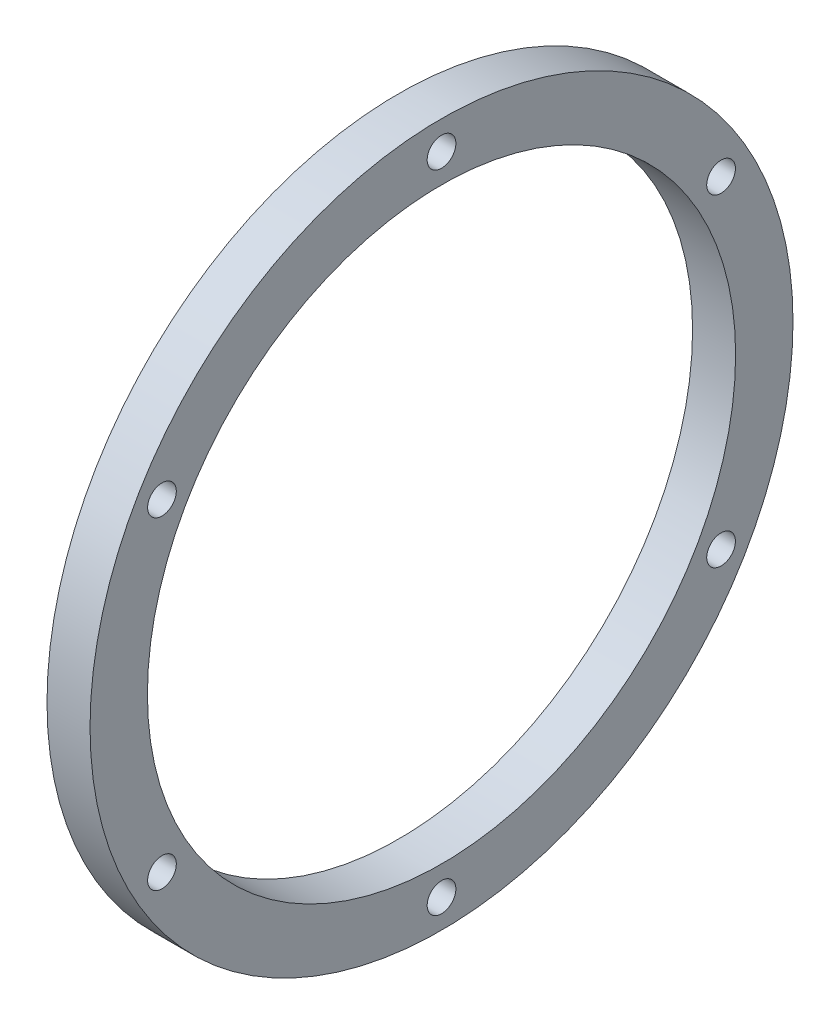
ISO-10303-21;
HEADER;
FILE_DESCRIPTION(('STEP AP214'),'2;1');
FILE_NAME('part.step','',(''),(''),'','','');
FILE_SCHEMA(('AUTOMOTIVE_DESIGN { 1 0 10303 214 1 1 1 1 }'));
ENDSEC;
DATA;
#1=APPLICATION_CONTEXT('core data for automotive mechanical design processes');
#2=APPLICATION_PROTOCOL_DEFINITION('international standard','automotive_design',2000,#1);
#3=PRODUCT_CONTEXT('',#1,'mechanical');
#4=PRODUCT('Part','Part','',(#3));
#5=PRODUCT_RELATED_PRODUCT_CATEGORY('part','',(#4));
#6=PRODUCT_DEFINITION_FORMATION('','',#4);
#7=PRODUCT_DEFINITION_CONTEXT('part definition',#1,'design');
#8=PRODUCT_DEFINITION('design','',#6,#7);
#9=PRODUCT_DEFINITION_SHAPE('','',#8);
#10=(LENGTH_UNIT() NAMED_UNIT(*) SI_UNIT(.MILLI.,.METRE.));
#11=(NAMED_UNIT(*) PLANE_ANGLE_UNIT() SI_UNIT($,.RADIAN.));
#12=(NAMED_UNIT(*) SI_UNIT($,.STERADIAN.) SOLID_ANGLE_UNIT());
#13=UNCERTAINTY_MEASURE_WITH_UNIT(LENGTH_MEASURE(1.E-05),#10,'distance_accuracy_value','');
#14=(GEOMETRIC_REPRESENTATION_CONTEXT(3) GLOBAL_UNCERTAINTY_ASSIGNED_CONTEXT((#13)) GLOBAL_UNIT_ASSIGNED_CONTEXT((#10,
#11,#12)) REPRESENTATION_CONTEXT('',''));
#15=CARTESIAN_POINT('',(0.,0.,0.));
#16=DIRECTION('',(0.,0.,1.));
#17=DIRECTION('',(1.,0.,0.));
#18=AXIS2_PLACEMENT_3D('',#15,#16,#17);
#19=CARTESIAN_POINT('',(6.,0.,0.));
#20=DIRECTION('',(1.,0.,0.));
#21=DIRECTION('',(0.,0.,-1.));
#22=AXIS2_PLACEMENT_3D('',#19,#20,#21);
#23=PLANE('',#22);
#24=CARTESIAN_POINT('',(6.,22.5000000000005,-38.9711431702995));
#25=DIRECTION('',(1.,0.,0.));
#26=DIRECTION('',(0.,0.,-1.));
#27=AXIS2_PLACEMENT_3D('',#24,#25,#26);
#28=CIRCLE('',#27,1.99999999999999);
#29=CARTESIAN_POINT('',(6.,22.5000000000005,-40.9711431702995));
#30=VERTEX_POINT('',#29);
#31=EDGE_CURVE('E88',#30,#30,#28,.T.);
#32=ORIENTED_EDGE('',*,*,#31,.F.);
#33=EDGE_LOOP('',(#32));
#34=FACE_BOUND('',#33,.T.);
#35=CARTESIAN_POINT('',(6.,-22.4999999999996,-38.9711431702999));
#36=DIRECTION('',(1.,0.,0.));
#37=DIRECTION('',(0.,0.,-1.));
#38=AXIS2_PLACEMENT_3D('',#35,#36,#37);
#39=CIRCLE('',#38,1.99999999999999);
#40=CARTESIAN_POINT('',(6.,-22.4999999999996,-40.9711431702999));
#41=VERTEX_POINT('',#40);
#42=EDGE_CURVE('E82',#41,#41,#39,.T.);
#43=ORIENTED_EDGE('',*,*,#42,.F.);
#44=EDGE_LOOP('',(#43));
#45=FACE_BOUND('',#44,.T.);
#46=CARTESIAN_POINT('',(6.,-45.,0.));
#47=DIRECTION('',(1.,0.,0.));
#48=DIRECTION('',(0.,0.,-1.));
#49=AXIS2_PLACEMENT_3D('',#46,#47,#48);
#50=CIRCLE('',#49,1.99999999999999);
#51=CARTESIAN_POINT('',(6.,-45.,-1.99999999999999));
#52=VERTEX_POINT('',#51);
#53=EDGE_CURVE('E76',#52,#52,#50,.T.);
#54=ORIENTED_EDGE('',*,*,#53,.F.);
#55=EDGE_LOOP('',(#54));
#56=FACE_BOUND('',#55,.T.);
#57=CARTESIAN_POINT('',(6.,-22.5000000000002,38.9711431702996));
#58=DIRECTION('',(1.,0.,0.));
#59=DIRECTION('',(0.,0.,-1.));
#60=AXIS2_PLACEMENT_3D('',#57,#58,#59);
#61=CIRCLE('',#60,1.99999999999999);
#62=CARTESIAN_POINT('',(6.,-22.5000000000002,36.9711431702996));
#63=VERTEX_POINT('',#62);
#64=EDGE_CURVE('E70',#63,#63,#61,.T.);
#65=ORIENTED_EDGE('',*,*,#64,.F.);
#66=EDGE_LOOP('',(#65));
#67=FACE_BOUND('',#66,.T.);
#68=CARTESIAN_POINT('',(6.,22.4999999999999,38.9711431702998));
#69=DIRECTION('',(1.,0.,0.));
#70=DIRECTION('',(0.,0.,-1.));
#71=AXIS2_PLACEMENT_3D('',#68,#69,#70);
#72=CIRCLE('',#71,1.99999999999999);
#73=CARTESIAN_POINT('',(6.,22.4999999999999,36.9711431702998));
#74=VERTEX_POINT('',#73);
#75=EDGE_CURVE('E64',#74,#74,#72,.T.);
#76=ORIENTED_EDGE('',*,*,#75,.F.);
#77=EDGE_LOOP('',(#76));
#78=FACE_BOUND('',#77,.T.);
#79=CARTESIAN_POINT('',(6.,45.,0.));
#80=DIRECTION('',(1.,0.,0.));
#81=DIRECTION('',(0.,0.,-1.));
#82=AXIS2_PLACEMENT_3D('',#79,#80,#81);
#83=CIRCLE('',#82,1.99999999999999);
#84=CARTESIAN_POINT('',(6.,45.,-1.99999999999999));
#85=VERTEX_POINT('',#84);
#86=EDGE_CURVE('E58',#85,#85,#83,.T.);
#87=ORIENTED_EDGE('',*,*,#86,.F.);
#88=EDGE_LOOP('',(#87));
#89=FACE_BOUND('',#88,.T.);
#90=CARTESIAN_POINT('',(6.,0.,0.));
#91=DIRECTION('',(1.,0.,0.));
#92=DIRECTION('',(0.,0.,-1.));
#93=AXIS2_PLACEMENT_3D('',#90,#91,#92);
#94=CIRCLE('',#93,49.);
#95=CARTESIAN_POINT('',(6.,0.,-49.));
#96=VERTEX_POINT('',#95);
#97=EDGE_CURVE('E10',#96,#96,#94,.T.);
#98=ORIENTED_EDGE('',*,*,#97,.T.);
#99=EDGE_LOOP('',(#98));
#100=FACE_BOUND('',#99,.T.);
#101=CARTESIAN_POINT('',(6.,0.,0.));
#102=DIRECTION('',(1.,0.,0.));
#103=DIRECTION('',(0.,0.,-1.));
#104=AXIS2_PLACEMENT_3D('',#101,#102,#103);
#105=CIRCLE('',#104,41.);
#106=CARTESIAN_POINT('',(6.,0.,-41.));
#107=VERTEX_POINT('',#106);
#108=EDGE_CURVE('E48',#107,#107,#105,.T.);
#109=ORIENTED_EDGE('',*,*,#108,.F.);
#110=EDGE_LOOP('',(#109));
#111=FACE_BOUND('',#110,.T.);
#112=ADVANCED_FACE('F37',(#34,#45,#56,#67,#78,#89,#100,#111),#23,.T.);
#113=CARTESIAN_POINT('',(0.,0.,0.));
#114=DIRECTION('',(1.,0.,0.));
#115=DIRECTION('',(0.,0.,-1.));
#116=AXIS2_PLACEMENT_3D('',#113,#114,#115);
#117=PLANE('',#116);
#118=CARTESIAN_POINT('',(0.,22.5000000000005,-38.9711431702995));
#119=DIRECTION('',(1.,0.,0.));
#120=DIRECTION('',(0.,0.,-1.));
#121=AXIS2_PLACEMENT_3D('',#118,#119,#120);
#122=CIRCLE('',#121,1.99999999999999);
#123=CARTESIAN_POINT('',(0.,22.5000000000005,-40.9711431702995));
#124=VERTEX_POINT('',#123);
#125=EDGE_CURVE('E85',#124,#124,#122,.T.);
#126=ORIENTED_EDGE('',*,*,#125,.T.);
#127=EDGE_LOOP('',(#126));
#128=FACE_BOUND('',#127,.T.);
#129=CARTESIAN_POINT('',(0.,-22.4999999999996,-38.9711431702999));
#130=DIRECTION('',(1.,0.,0.));
#131=DIRECTION('',(0.,0.,-1.));
#132=AXIS2_PLACEMENT_3D('',#129,#130,#131);
#133=CIRCLE('',#132,1.99999999999999);
#134=CARTESIAN_POINT('',(0.,-22.4999999999996,-40.9711431702999));
#135=VERTEX_POINT('',#134);
#136=EDGE_CURVE('E79',#135,#135,#133,.T.);
#137=ORIENTED_EDGE('',*,*,#136,.T.);
#138=EDGE_LOOP('',(#137));
#139=FACE_BOUND('',#138,.T.);
#140=CARTESIAN_POINT('',(0.,-45.,0.));
#141=DIRECTION('',(1.,0.,0.));
#142=DIRECTION('',(0.,0.,-1.));
#143=AXIS2_PLACEMENT_3D('',#140,#141,#142);
#144=CIRCLE('',#143,1.99999999999999);
#145=CARTESIAN_POINT('',(0.,-45.,-1.99999999999999));
#146=VERTEX_POINT('',#145);
#147=EDGE_CURVE('E73',#146,#146,#144,.T.);
#148=ORIENTED_EDGE('',*,*,#147,.T.);
#149=EDGE_LOOP('',(#148));
#150=FACE_BOUND('',#149,.T.);
#151=CARTESIAN_POINT('',(0.,-22.5000000000002,38.9711431702996));
#152=DIRECTION('',(1.,0.,0.));
#153=DIRECTION('',(0.,0.,-1.));
#154=AXIS2_PLACEMENT_3D('',#151,#152,#153);
#155=CIRCLE('',#154,1.99999999999999);
#156=CARTESIAN_POINT('',(0.,-22.5000000000002,36.9711431702996));
#157=VERTEX_POINT('',#156);
#158=EDGE_CURVE('E67',#157,#157,#155,.T.);
#159=ORIENTED_EDGE('',*,*,#158,.T.);
#160=EDGE_LOOP('',(#159));
#161=FACE_BOUND('',#160,.T.);
#162=CARTESIAN_POINT('',(0.,22.4999999999999,38.9711431702998));
#163=DIRECTION('',(1.,0.,0.));
#164=DIRECTION('',(0.,0.,-1.));
#165=AXIS2_PLACEMENT_3D('',#162,#163,#164);
#166=CIRCLE('',#165,1.99999999999999);
#167=CARTESIAN_POINT('',(0.,22.4999999999999,36.9711431702998));
#168=VERTEX_POINT('',#167);
#169=EDGE_CURVE('E61',#168,#168,#166,.T.);
#170=ORIENTED_EDGE('',*,*,#169,.T.);
#171=EDGE_LOOP('',(#170));
#172=FACE_BOUND('',#171,.T.);
#173=CARTESIAN_POINT('',(0.,45.,0.));
#174=DIRECTION('',(1.,0.,0.));
#175=DIRECTION('',(0.,0.,-1.));
#176=AXIS2_PLACEMENT_3D('',#173,#174,#175);
#177=CIRCLE('',#176,1.99999999999999);
#178=CARTESIAN_POINT('',(0.,45.,-1.99999999999999));
#179=VERTEX_POINT('',#178);
#180=EDGE_CURVE('E53',#179,#179,#177,.T.);
#181=ORIENTED_EDGE('',*,*,#180,.T.);
#182=EDGE_LOOP('',(#181));
#183=FACE_BOUND('',#182,.T.);
#184=CARTESIAN_POINT('',(0.,0.,0.));
#185=DIRECTION('',(1.,0.,0.));
#186=DIRECTION('',(0.,0.,-1.));
#187=AXIS2_PLACEMENT_3D('',#184,#185,#186);
#188=CIRCLE('',#187,49.);
#189=CARTESIAN_POINT('',(0.,0.,-49.));
#190=VERTEX_POINT('',#189);
#191=EDGE_CURVE('E41',#190,#190,#188,.T.);
#192=ORIENTED_EDGE('',*,*,#191,.F.);
#193=EDGE_LOOP('',(#192));
#194=FACE_BOUND('',#193,.T.);
#195=CARTESIAN_POINT('',(0.,0.,0.));
#196=DIRECTION('',(1.,0.,0.));
#197=DIRECTION('',(0.,0.,-1.));
#198=AXIS2_PLACEMENT_3D('',#195,#196,#197);
#199=CIRCLE('',#198,41.);
#200=CARTESIAN_POINT('',(0.,0.,-41.));
#201=VERTEX_POINT('',#200);
#202=EDGE_CURVE('E50',#201,#201,#199,.T.);
#203=ORIENTED_EDGE('',*,*,#202,.T.);
#204=EDGE_LOOP('',(#203));
#205=FACE_BOUND('',#204,.T.);
#206=ADVANCED_FACE('F97',(#128,#139,#150,#161,#172,#183,#194,#205),#117,.F.);
#207=CARTESIAN_POINT('',(6.,0.,0.));
#208=DIRECTION('',(-1.,0.,0.));
#209=DIRECTION('',(0.,0.,1.));
#210=AXIS2_PLACEMENT_3D('',#207,#208,#209);
#211=CYLINDRICAL_SURFACE('',#210,49.);
#212=ORIENTED_EDGE('',*,*,#97,.F.);
#213=EDGE_LOOP('',(#212));
#214=FACE_BOUND('',#213,.T.);
#215=ORIENTED_EDGE('',*,*,#191,.T.);
#216=EDGE_LOOP('',(#215));
#217=FACE_BOUND('',#216,.T.);
#218=ADVANCED_FACE('F39',(#214,#217),#211,.T.);
#219=CARTESIAN_POINT('',(6.,0.,0.));
#220=DIRECTION('',(-1.,0.,0.));
#221=DIRECTION('',(0.,0.,1.));
#222=AXIS2_PLACEMENT_3D('',#219,#220,#221);
#223=CYLINDRICAL_SURFACE('',#222,41.);
#224=ORIENTED_EDGE('',*,*,#108,.T.);
#225=EDGE_LOOP('',(#224));
#226=FACE_BOUND('',#225,.T.);
#227=ORIENTED_EDGE('',*,*,#202,.F.);
#228=EDGE_LOOP('',(#227));
#229=FACE_BOUND('',#228,.T.);
#230=ADVANCED_FACE('F111',(#226,#229),#223,.F.);
#231=CARTESIAN_POINT('',(6.,45.,0.));
#232=DIRECTION('',(1.,0.,0.));
#233=DIRECTION('',(0.,0.,-1.));
#234=AXIS2_PLACEMENT_3D('',#231,#232,#233);
#235=CYLINDRICAL_SURFACE('',#234,1.99999999999999);
#236=ORIENTED_EDGE('',*,*,#86,.T.);
#237=EDGE_LOOP('',(#236));
#238=FACE_BOUND('',#237,.T.);
#239=ORIENTED_EDGE('',*,*,#180,.F.);
#240=EDGE_LOOP('',(#239));
#241=FACE_BOUND('',#240,.T.);
#242=ADVANCED_FACE('F114',(#238,#241),#235,.F.);
#243=CARTESIAN_POINT('',(6.,22.4999999999999,38.9711431702998));
#244=DIRECTION('',(1.,0.,0.));
#245=DIRECTION('',(0.,0.,-1.));
#246=AXIS2_PLACEMENT_3D('',#243,#244,#245);
#247=CYLINDRICAL_SURFACE('',#246,1.99999999999999);
#248=ORIENTED_EDGE('',*,*,#75,.T.);
#249=EDGE_LOOP('',(#248));
#250=FACE_BOUND('',#249,.T.);
#251=ORIENTED_EDGE('',*,*,#169,.F.);
#252=EDGE_LOOP('',(#251));
#253=FACE_BOUND('',#252,.T.);
#254=ADVANCED_FACE('F128',(#250,#253),#247,.F.);
#255=CARTESIAN_POINT('',(6.,-22.5000000000002,38.9711431702996));
#256=DIRECTION('',(1.,0.,0.));
#257=DIRECTION('',(0.,0.,-1.));
#258=AXIS2_PLACEMENT_3D('',#255,#256,#257);
#259=CYLINDRICAL_SURFACE('',#258,1.99999999999999);
#260=ORIENTED_EDGE('',*,*,#64,.T.);
#261=EDGE_LOOP('',(#260));
#262=FACE_BOUND('',#261,.T.);
#263=ORIENTED_EDGE('',*,*,#158,.F.);
#264=EDGE_LOOP('',(#263));
#265=FACE_BOUND('',#264,.T.);
#266=ADVANCED_FACE('F132',(#262,#265),#259,.F.);
#267=CARTESIAN_POINT('',(6.,-45.,0.));
#268=DIRECTION('',(1.,0.,0.));
#269=DIRECTION('',(0.,0.,-1.));
#270=AXIS2_PLACEMENT_3D('',#267,#268,#269);
#271=CYLINDRICAL_SURFACE('',#270,1.99999999999999);
#272=ORIENTED_EDGE('',*,*,#53,.T.);
#273=EDGE_LOOP('',(#272));
#274=FACE_BOUND('',#273,.T.);
#275=ORIENTED_EDGE('',*,*,#147,.F.);
#276=EDGE_LOOP('',(#275));
#277=FACE_BOUND('',#276,.T.);
#278=ADVANCED_FACE('F136',(#274,#277),#271,.F.);
#279=CARTESIAN_POINT('',(6.,-22.4999999999996,-38.9711431702999));
#280=DIRECTION('',(1.,0.,0.));
#281=DIRECTION('',(0.,0.,-1.));
#282=AXIS2_PLACEMENT_3D('',#279,#280,#281);
#283=CYLINDRICAL_SURFACE('',#282,1.99999999999999);
#284=ORIENTED_EDGE('',*,*,#42,.T.);
#285=EDGE_LOOP('',(#284));
#286=FACE_BOUND('',#285,.T.);
#287=ORIENTED_EDGE('',*,*,#136,.F.);
#288=EDGE_LOOP('',(#287));
#289=FACE_BOUND('',#288,.T.);
#290=ADVANCED_FACE('F140',(#286,#289),#283,.F.);
#291=CARTESIAN_POINT('',(6.,22.5000000000005,-38.9711431702995));
#292=DIRECTION('',(1.,0.,0.));
#293=DIRECTION('',(0.,0.,-1.));
#294=AXIS2_PLACEMENT_3D('',#291,#292,#293);
#295=CYLINDRICAL_SURFACE('',#294,1.99999999999999);
#296=ORIENTED_EDGE('',*,*,#31,.T.);
#297=EDGE_LOOP('',(#296));
#298=FACE_BOUND('',#297,.T.);
#299=ORIENTED_EDGE('',*,*,#125,.F.);
#300=EDGE_LOOP('',(#299));
#301=FACE_BOUND('',#300,.T.);
#302=ADVANCED_FACE('F92',(#298,#301),#295,.F.);
#303=CLOSED_SHELL('',(#112,#206,#218,#230,#242,#254,#266,#278,#290,#302));
#304=MANIFOLD_SOLID_BREP('B2',#303);
#305=ADVANCED_BREP_SHAPE_REPRESENTATION('',(#18,#304),#14);
#306=SHAPE_DEFINITION_REPRESENTATION(#9,#305);
ENDSEC;
END-ISO-10303-21;
